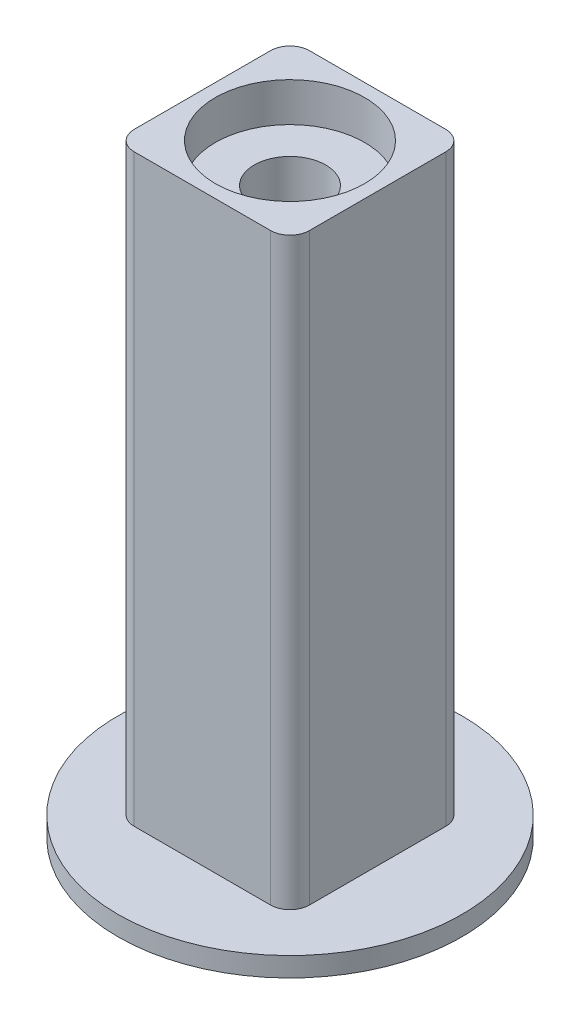
ISO-10303-21;
HEADER;
FILE_DESCRIPTION(('STEP AP214'),'2;1');
FILE_NAME('part.step','',(''),(''),'','','');
FILE_SCHEMA(('AUTOMOTIVE_DESIGN { 1 0 10303 214 1 1 1 1 }'));
ENDSEC;
DATA;
#1=APPLICATION_CONTEXT('core data for automotive mechanical design processes');
#2=APPLICATION_PROTOCOL_DEFINITION('international standard','automotive_design',2000,#1);
#3=PRODUCT_CONTEXT('',#1,'mechanical');
#4=PRODUCT('Part','Part','',(#3));
#5=PRODUCT_RELATED_PRODUCT_CATEGORY('part','',(#4));
#6=PRODUCT_DEFINITION_FORMATION('','',#4);
#7=PRODUCT_DEFINITION_CONTEXT('part definition',#1,'design');
#8=PRODUCT_DEFINITION('design','',#6,#7);
#9=PRODUCT_DEFINITION_SHAPE('','',#8);
#10=(LENGTH_UNIT() NAMED_UNIT(*) SI_UNIT(.MILLI.,.METRE.));
#11=(NAMED_UNIT(*) PLANE_ANGLE_UNIT() SI_UNIT($,.RADIAN.));
#12=(NAMED_UNIT(*) SI_UNIT($,.STERADIAN.) SOLID_ANGLE_UNIT());
#13=UNCERTAINTY_MEASURE_WITH_UNIT(LENGTH_MEASURE(1.E-05),#10,'distance_accuracy_value','');
#14=(GEOMETRIC_REPRESENTATION_CONTEXT(3) GLOBAL_UNCERTAINTY_ASSIGNED_CONTEXT((#13)) GLOBAL_UNIT_ASSIGNED_CONTEXT((#10,
#11,#12)) REPRESENTATION_CONTEXT('',''));
#15=CARTESIAN_POINT('',(0.,0.,0.));
#16=DIRECTION('',(0.,0.,1.));
#17=DIRECTION('',(1.,0.,0.));
#18=AXIS2_PLACEMENT_3D('',#15,#16,#17);
#19=CARTESIAN_POINT('',(0.,3.,0.));
#20=DIRECTION('',(0.,-1.,0.));
#21=DIRECTION('',(0.,0.,-1.));
#22=AXIS2_PLACEMENT_3D('',#19,#20,#21);
#23=CYLINDRICAL_SURFACE('',#22,26.5);
#24=CARTESIAN_POINT('',(0.,3.,0.));
#25=DIRECTION('',(0.,1.,0.));
#26=DIRECTION('',(0.,0.,1.));
#27=AXIS2_PLACEMENT_3D('',#24,#25,#26);
#28=CIRCLE('',#27,26.5);
#29=CARTESIAN_POINT('',(0.,3.,26.5));
#30=VERTEX_POINT('',#29);
#31=EDGE_CURVE('E147',#30,#30,#28,.T.);
#32=ORIENTED_EDGE('',*,*,#31,.F.);
#33=EDGE_LOOP('',(#32));
#34=FACE_BOUND('',#33,.T.);
#35=CARTESIAN_POINT('',(0.,0.,0.));
#36=DIRECTION('',(0.,1.,0.));
#37=DIRECTION('',(0.,0.,1.));
#38=AXIS2_PLACEMENT_3D('',#35,#36,#37);
#39=CIRCLE('',#38,26.5);
#40=CARTESIAN_POINT('',(0.,0.,26.5));
#41=VERTEX_POINT('',#40);
#42=EDGE_CURVE('E151',#41,#41,#39,.T.);
#43=ORIENTED_EDGE('',*,*,#42,.T.);
#44=EDGE_LOOP('',(#43));
#45=FACE_BOUND('',#44,.T.);
#46=ADVANCED_FACE('F39',(#34,#45),#23,.T.);
#47=CARTESIAN_POINT('',(0.,3.,0.));
#48=DIRECTION('',(0.,1.,0.));
#49=DIRECTION('',(0.,0.,1.));
#50=AXIS2_PLACEMENT_3D('',#47,#48,#49);
#51=PLANE('',#50);
#52=DIRECTION('',(0.,0.,-1.));
#53=VECTOR('',#52,1.);
#54=CARTESIAN_POINT('',(13.5,3.,-13.5));
#55=LINE('',#54,#53);
#56=CARTESIAN_POINT('',(13.5,3.,10.5));
#57=VERTEX_POINT('',#56);
#58=CARTESIAN_POINT('',(13.5,3.,-10.5));
#59=VERTEX_POINT('',#58);
#60=EDGE_CURVE('E133',#57,#59,#55,.T.);
#61=ORIENTED_EDGE('',*,*,#60,.F.);
#62=CARTESIAN_POINT('',(10.5,3.,10.5));
#63=DIRECTION('',(0.,1.,0.));
#64=DIRECTION('',(0.,0.,1.));
#65=AXIS2_PLACEMENT_3D('',#62,#63,#64);
#66=CIRCLE('',#65,3.);
#67=CARTESIAN_POINT('',(10.5,3.,13.5));
#68=VERTEX_POINT('',#67);
#69=EDGE_CURVE('E11',#57,#68,#66,.F.);
#70=ORIENTED_EDGE('',*,*,#69,.T.);
#71=DIRECTION('',(1.,0.,0.));
#72=VECTOR('',#71,1.);
#73=CARTESIAN_POINT('',(-13.5,3.,13.5));
#74=LINE('',#73,#72);
#75=CARTESIAN_POINT('',(-10.5,3.,13.5));
#76=VERTEX_POINT('',#75);
#77=EDGE_CURVE('E138',#76,#68,#74,.T.);
#78=ORIENTED_EDGE('',*,*,#77,.F.);
#79=CARTESIAN_POINT('',(-10.5,3.,10.5));
#80=DIRECTION('',(0.,1.,0.));
#81=DIRECTION('',(0.,0.,1.));
#82=AXIS2_PLACEMENT_3D('',#79,#80,#81);
#83=CIRCLE('',#82,3.);
#84=CARTESIAN_POINT('',(-13.5,3.,10.5));
#85=VERTEX_POINT('',#84);
#86=EDGE_CURVE('E48',#76,#85,#83,.F.);
#87=ORIENTED_EDGE('',*,*,#86,.T.);
#88=DIRECTION('',(0.,0.,1.));
#89=VECTOR('',#88,1.);
#90=CARTESIAN_POINT('',(-13.5,3.,-13.5));
#91=LINE('',#90,#89);
#92=CARTESIAN_POINT('',(-13.5,3.,-10.5));
#93=VERTEX_POINT('',#92);
#94=EDGE_CURVE('E132',#93,#85,#91,.T.);
#95=ORIENTED_EDGE('',*,*,#94,.F.);
#96=CARTESIAN_POINT('',(-10.5,3.,-10.5));
#97=DIRECTION('',(0.,1.,0.));
#98=DIRECTION('',(0.,0.,1.));
#99=AXIS2_PLACEMENT_3D('',#96,#97,#98);
#100=CIRCLE('',#99,3.);
#101=CARTESIAN_POINT('',(-10.5,3.,-13.5));
#102=VERTEX_POINT('',#101);
#103=EDGE_CURVE('E113',#93,#102,#100,.F.);
#104=ORIENTED_EDGE('',*,*,#103,.T.);
#105=DIRECTION('',(-1.,0.,0.));
#106=VECTOR('',#105,1.);
#107=CARTESIAN_POINT('',(-13.5,3.,-13.5));
#108=LINE('',#107,#106);
#109=CARTESIAN_POINT('',(10.5,3.,-13.5));
#110=VERTEX_POINT('',#109);
#111=EDGE_CURVE('E120',#110,#102,#108,.T.);
#112=ORIENTED_EDGE('',*,*,#111,.F.);
#113=CARTESIAN_POINT('',(10.5,3.,-10.5));
#114=DIRECTION('',(0.,1.,0.));
#115=DIRECTION('',(0.,0.,1.));
#116=AXIS2_PLACEMENT_3D('',#113,#114,#115);
#117=CIRCLE('',#116,3.);
#118=EDGE_CURVE('E104',#110,#59,#117,.F.);
#119=ORIENTED_EDGE('',*,*,#118,.T.);
#120=EDGE_LOOP('',(#61,#70,#78,#87,#95,#104,#112,#119));
#121=FACE_BOUND('',#120,.T.);
#122=ORIENTED_EDGE('',*,*,#31,.T.);
#123=EDGE_LOOP('',(#122));
#124=FACE_BOUND('',#123,.T.);
#125=ADVANCED_FACE('F128',(#121,#124),#51,.T.);
#126=CARTESIAN_POINT('',(0.,0.,0.));
#127=DIRECTION('',(0.,1.,0.));
#128=DIRECTION('',(0.,0.,1.));
#129=AXIS2_PLACEMENT_3D('',#126,#127,#128);
#130=PLANE('',#129);
#131=ORIENTED_EDGE('',*,*,#42,.F.);
#132=EDGE_LOOP('',(#131));
#133=FACE_BOUND('',#132,.T.);
#134=ADVANCED_FACE('F255',(#133),#130,.F.);
#135=CARTESIAN_POINT('',(13.5,93.,-13.5));
#136=DIRECTION('',(-1.,0.,0.));
#137=DIRECTION('',(0.,0.,1.));
#138=AXIS2_PLACEMENT_3D('',#135,#136,#137);
#139=PLANE('',#138);
#140=ORIENTED_EDGE('',*,*,#60,.T.);
#141=DIRECTION('',(0.,-1.,0.));
#142=VECTOR('',#141,1.);
#143=CARTESIAN_POINT('',(13.5,93.,-10.5));
#144=LINE('',#143,#142);
#145=CARTESIAN_POINT('',(13.5,93.,-10.5));
#146=VERTEX_POINT('',#145);
#147=EDGE_CURVE('E109',#59,#146,#144,.F.);
#148=ORIENTED_EDGE('',*,*,#147,.T.);
#149=DIRECTION('',(0.,0.,-1.));
#150=VECTOR('',#149,1.);
#151=CARTESIAN_POINT('',(13.5,93.,-13.5));
#152=LINE('',#151,#150);
#153=CARTESIAN_POINT('',(13.5,93.,10.5));
#154=VERTEX_POINT('',#153);
#155=EDGE_CURVE('E146',#154,#146,#152,.T.);
#156=ORIENTED_EDGE('',*,*,#155,.F.);
#157=DIRECTION('',(0.,-1.,0.));
#158=VECTOR('',#157,1.);
#159=CARTESIAN_POINT('',(13.5,93.,10.5));
#160=LINE('',#159,#158);
#161=EDGE_CURVE('E125',#154,#57,#160,.T.);
#162=ORIENTED_EDGE('',*,*,#161,.T.);
#163=EDGE_LOOP('',(#140,#148,#156,#162));
#164=FACE_BOUND('',#163,.T.);
#165=ADVANCED_FACE('F277',(#164),#139,.F.);
#166=CARTESIAN_POINT('',(-13.5,93.,-13.5));
#167=DIRECTION('',(0.,0.,1.));
#168=DIRECTION('',(1.,0.,0.));
#169=AXIS2_PLACEMENT_3D('',#166,#167,#168);
#170=PLANE('',#169);
#171=DIRECTION('',(-1.,0.,0.));
#172=VECTOR('',#171,1.);
#173=CARTESIAN_POINT('',(-13.5,93.,-13.5));
#174=LINE('',#173,#172);
#175=CARTESIAN_POINT('',(10.5,93.,-13.5));
#176=VERTEX_POINT('',#175);
#177=CARTESIAN_POINT('',(-10.5,93.,-13.5));
#178=VERTEX_POINT('',#177);
#179=EDGE_CURVE('E123',#176,#178,#174,.T.);
#180=ORIENTED_EDGE('',*,*,#179,.F.);
#181=DIRECTION('',(0.,-1.,0.));
#182=VECTOR('',#181,1.);
#183=CARTESIAN_POINT('',(10.5,93.,-13.5));
#184=LINE('',#183,#182);
#185=EDGE_CURVE('E108',#176,#110,#184,.T.);
#186=ORIENTED_EDGE('',*,*,#185,.T.);
#187=ORIENTED_EDGE('',*,*,#111,.T.);
#188=DIRECTION('',(0.,-1.,0.));
#189=VECTOR('',#188,1.);
#190=CARTESIAN_POINT('',(-10.5,93.,-13.5));
#191=LINE('',#190,#189);
#192=EDGE_CURVE('E126',#102,#178,#191,.F.);
#193=ORIENTED_EDGE('',*,*,#192,.T.);
#194=EDGE_LOOP('',(#180,#186,#187,#193));
#195=FACE_BOUND('',#194,.T.);
#196=ADVANCED_FACE('F119',(#195),#170,.F.);
#197=CARTESIAN_POINT('',(-13.5,93.,-13.5));
#198=DIRECTION('',(1.,0.,0.));
#199=DIRECTION('',(0.,0.,-1.));
#200=AXIS2_PLACEMENT_3D('',#197,#198,#199);
#201=PLANE('',#200);
#202=DIRECTION('',(0.,0.,1.));
#203=VECTOR('',#202,1.);
#204=CARTESIAN_POINT('',(-13.5,93.,-13.5));
#205=LINE('',#204,#203);
#206=CARTESIAN_POINT('',(-13.5,93.,-10.5));
#207=VERTEX_POINT('',#206);
#208=CARTESIAN_POINT('',(-13.5,93.,10.5));
#209=VERTEX_POINT('',#208);
#210=EDGE_CURVE('E207',#207,#209,#205,.T.);
#211=ORIENTED_EDGE('',*,*,#210,.F.);
#212=DIRECTION('',(0.,-1.,0.));
#213=VECTOR('',#212,1.);
#214=CARTESIAN_POINT('',(-13.5,93.,-10.5));
#215=LINE('',#214,#213);
#216=EDGE_CURVE('E183',#207,#93,#215,.T.);
#217=ORIENTED_EDGE('',*,*,#216,.T.);
#218=ORIENTED_EDGE('',*,*,#94,.T.);
#219=DIRECTION('',(0.,-1.,0.));
#220=VECTOR('',#219,1.);
#221=CARTESIAN_POINT('',(-13.5,93.,10.5));
#222=LINE('',#221,#220);
#223=EDGE_CURVE('E180',#85,#209,#222,.F.);
#224=ORIENTED_EDGE('',*,*,#223,.T.);
#225=EDGE_LOOP('',(#211,#217,#218,#224));
#226=FACE_BOUND('',#225,.T.);
#227=ADVANCED_FACE('F196',(#226),#201,.F.);
#228=CARTESIAN_POINT('',(-13.5,93.,13.5));
#229=DIRECTION('',(0.,0.,-1.));
#230=DIRECTION('',(-1.,0.,0.));
#231=AXIS2_PLACEMENT_3D('',#228,#229,#230);
#232=PLANE('',#231);
#233=DIRECTION('',(1.,0.,0.));
#234=VECTOR('',#233,1.);
#235=CARTESIAN_POINT('',(-13.5,93.,13.5));
#236=LINE('',#235,#234);
#237=CARTESIAN_POINT('',(-10.5,93.,13.5));
#238=VERTEX_POINT('',#237);
#239=CARTESIAN_POINT('',(10.5,93.,13.5));
#240=VERTEX_POINT('',#239);
#241=EDGE_CURVE('E155',#238,#240,#236,.T.);
#242=ORIENTED_EDGE('',*,*,#241,.F.);
#243=DIRECTION('',(0.,-1.,0.));
#244=VECTOR('',#243,1.);
#245=CARTESIAN_POINT('',(-10.5,93.,13.5));
#246=LINE('',#245,#244);
#247=EDGE_CURVE('E114',#238,#76,#246,.T.);
#248=ORIENTED_EDGE('',*,*,#247,.T.);
#249=ORIENTED_EDGE('',*,*,#77,.T.);
#250=DIRECTION('',(0.,-1.,0.));
#251=VECTOR('',#250,1.);
#252=CARTESIAN_POINT('',(10.5,93.,13.5));
#253=LINE('',#252,#251);
#254=EDGE_CURVE('E187',#68,#240,#253,.F.);
#255=ORIENTED_EDGE('',*,*,#254,.T.);
#256=EDGE_LOOP('',(#242,#248,#249,#255));
#257=FACE_BOUND('',#256,.T.);
#258=ADVANCED_FACE('F209',(#257),#232,.F.);
#259=CARTESIAN_POINT('',(0.,93.,0.));
#260=DIRECTION('',(0.,1.,0.));
#261=DIRECTION('',(0.,0.,1.));
#262=AXIS2_PLACEMENT_3D('',#259,#260,#261);
#263=PLANE('',#262);
#264=CARTESIAN_POINT('',(0.,93.,0.));
#265=DIRECTION('',(0.,1.,0.));
#266=DIRECTION('',(0.,0.,1.));
#267=AXIS2_PLACEMENT_3D('',#264,#265,#266);
#268=CIRCLE('',#267,11.5);
#269=CARTESIAN_POINT('',(0.,93.,11.5));
#270=VERTEX_POINT('',#269);
#271=EDGE_CURVE('E222',#270,#270,#268,.T.);
#272=ORIENTED_EDGE('',*,*,#271,.F.);
#273=EDGE_LOOP('',(#272));
#274=FACE_BOUND('',#273,.T.);
#275=ORIENTED_EDGE('',*,*,#155,.T.);
#276=CARTESIAN_POINT('',(10.5,93.,-10.5));
#277=DIRECTION('',(0.,1.,0.));
#278=DIRECTION('',(0.,0.,1.));
#279=AXIS2_PLACEMENT_3D('',#276,#277,#278);
#280=CIRCLE('',#279,3.);
#281=EDGE_CURVE('E177',#146,#176,#280,.T.);
#282=ORIENTED_EDGE('',*,*,#281,.T.);
#283=ORIENTED_EDGE('',*,*,#179,.T.);
#284=CARTESIAN_POINT('',(-10.5,93.,-10.5));
#285=DIRECTION('',(0.,1.,0.));
#286=DIRECTION('',(0.,0.,1.));
#287=AXIS2_PLACEMENT_3D('',#284,#285,#286);
#288=CIRCLE('',#287,3.);
#289=EDGE_CURVE('E174',#178,#207,#288,.T.);
#290=ORIENTED_EDGE('',*,*,#289,.T.);
#291=ORIENTED_EDGE('',*,*,#210,.T.);
#292=CARTESIAN_POINT('',(-10.5,93.,10.5));
#293=DIRECTION('',(0.,1.,0.));
#294=DIRECTION('',(0.,0.,1.));
#295=AXIS2_PLACEMENT_3D('',#292,#293,#294);
#296=CIRCLE('',#295,3.);
#297=EDGE_CURVE('E171',#209,#238,#296,.T.);
#298=ORIENTED_EDGE('',*,*,#297,.T.);
#299=ORIENTED_EDGE('',*,*,#241,.T.);
#300=CARTESIAN_POINT('',(10.5,93.,10.5));
#301=DIRECTION('',(0.,1.,0.));
#302=DIRECTION('',(0.,0.,1.));
#303=AXIS2_PLACEMENT_3D('',#300,#301,#302);
#304=CIRCLE('',#303,3.);
#305=EDGE_CURVE('E168',#240,#154,#304,.T.);
#306=ORIENTED_EDGE('',*,*,#305,.T.);
#307=EDGE_LOOP('',(#275,#282,#283,#290,#291,#298,#299,#306));
#308=FACE_BOUND('',#307,.T.);
#309=ADVANCED_FACE('F205',(#274,#308),#263,.T.);
#310=CARTESIAN_POINT('',(0.,87.,0.));
#311=DIRECTION('',(0.,1.,0.));
#312=DIRECTION('',(0.,0.,1.));
#313=AXIS2_PLACEMENT_3D('',#310,#311,#312);
#314=PLANE('',#313);
#315=CARTESIAN_POINT('',(0.,87.,0.));
#316=DIRECTION('',(0.,1.,0.));
#317=DIRECTION('',(0.,0.,1.));
#318=AXIS2_PLACEMENT_3D('',#315,#316,#317);
#319=CIRCLE('',#318,11.5);
#320=CARTESIAN_POINT('',(0.,87.,11.5));
#321=VERTEX_POINT('',#320);
#322=EDGE_CURVE('E160',#321,#321,#319,.T.);
#323=ORIENTED_EDGE('',*,*,#322,.T.);
#324=EDGE_LOOP('',(#323));
#325=FACE_BOUND('',#324,.T.);
#326=CARTESIAN_POINT('',(0.,87.,0.));
#327=DIRECTION('',(0.,1.,0.));
#328=DIRECTION('',(0.,0.,1.));
#329=AXIS2_PLACEMENT_3D('',#326,#327,#328);
#330=CIRCLE('',#329,5.5);
#331=CARTESIAN_POINT('',(0.,87.,5.5));
#332=VERTEX_POINT('',#331);
#333=EDGE_CURVE('E156',#332,#332,#330,.F.);
#334=ORIENTED_EDGE('',*,*,#333,.T.);
#335=EDGE_LOOP('',(#334));
#336=FACE_BOUND('',#335,.T.);
#337=ADVANCED_FACE('F230',(#325,#336),#314,.T.);
#338=CARTESIAN_POINT('',(0.,87.,0.));
#339=DIRECTION('',(0.,1.,0.));
#340=DIRECTION('',(0.,0.,1.));
#341=AXIS2_PLACEMENT_3D('',#338,#339,#340);
#342=CYLINDRICAL_SURFACE('',#341,11.5);
#343=ORIENTED_EDGE('',*,*,#322,.F.);
#344=EDGE_LOOP('',(#343));
#345=FACE_BOUND('',#344,.T.);
#346=ORIENTED_EDGE('',*,*,#271,.T.);
#347=EDGE_LOOP('',(#346));
#348=FACE_BOUND('',#347,.T.);
#349=ADVANCED_FACE('F233',(#345,#348),#342,.F.);
#350=CARTESIAN_POINT('',(0.,3.,0.));
#351=DIRECTION('',(0.,1.,0.));
#352=DIRECTION('',(0.,0.,1.));
#353=AXIS2_PLACEMENT_3D('',#350,#351,#352);
#354=PLANE('',#353);
#355=CARTESIAN_POINT('',(0.,3.,0.));
#356=DIRECTION('',(0.,1.,0.));
#357=DIRECTION('',(0.,0.,1.));
#358=AXIS2_PLACEMENT_3D('',#355,#356,#357);
#359=CIRCLE('',#358,5.5);
#360=CARTESIAN_POINT('',(0.,3.,5.5));
#361=VERTEX_POINT('',#360);
#362=EDGE_CURVE('E140',#361,#361,#359,.T.);
#363=ORIENTED_EDGE('',*,*,#362,.T.);
#364=EDGE_LOOP('',(#363));
#365=FACE_BOUND('',#364,.T.);
#366=ADVANCED_FACE('F236',(#365),#354,.T.);
#367=CARTESIAN_POINT('',(0.,3.,0.));
#368=DIRECTION('',(0.,1.,0.));
#369=DIRECTION('',(0.,0.,1.));
#370=AXIS2_PLACEMENT_3D('',#367,#368,#369);
#371=CYLINDRICAL_SURFACE('',#370,5.5);
#372=CARTESIAN_POINT('',(0.,3.,5.5));
#373=CARTESIAN_POINT('',(0.,3.875,5.5));
#374=CARTESIAN_POINT('',(0.,4.75,5.5));
#375=CARTESIAN_POINT('',(0.,6.5,5.5));
#376=CARTESIAN_POINT('',(0.,7.375,5.5));
#377=CARTESIAN_POINT('',(0.,9.125,5.5));
#378=CARTESIAN_POINT('',(0.,10.,5.5));
#379=CARTESIAN_POINT('',(0.,11.75,5.5));
#380=CARTESIAN_POINT('',(0.,12.625,5.5));
#381=CARTESIAN_POINT('',(0.,14.375,5.5));
#382=CARTESIAN_POINT('',(0.,15.25,5.5));
#383=CARTESIAN_POINT('',(0.,17.,5.5));
#384=CARTESIAN_POINT('',(0.,17.875,5.5));
#385=CARTESIAN_POINT('',(0.,19.625,5.5));
#386=CARTESIAN_POINT('',(0.,20.5,5.5));
#387=CARTESIAN_POINT('',(0.,22.25,5.5));
#388=CARTESIAN_POINT('',(0.,23.125,5.5));
#389=CARTESIAN_POINT('',(0.,24.875,5.5));
#390=CARTESIAN_POINT('',(0.,25.75,5.5));
#391=CARTESIAN_POINT('',(0.,27.5,5.5));
#392=CARTESIAN_POINT('',(0.,28.375,5.5));
#393=CARTESIAN_POINT('',(0.,30.125,5.5));
#394=CARTESIAN_POINT('',(0.,31.,5.5));
#395=CARTESIAN_POINT('',(0.,32.75,5.5));
#396=CARTESIAN_POINT('',(0.,33.625,5.5));
#397=CARTESIAN_POINT('',(0.,35.375,5.5));
#398=CARTESIAN_POINT('',(0.,36.25,5.5));
#399=CARTESIAN_POINT('',(0.,38.,5.5));
#400=CARTESIAN_POINT('',(0.,38.875,5.5));
#401=CARTESIAN_POINT('',(0.,40.625,5.5));
#402=CARTESIAN_POINT('',(0.,41.5,5.5));
#403=CARTESIAN_POINT('',(0.,43.25,5.5));
#404=CARTESIAN_POINT('',(0.,44.125,5.5));
#405=CARTESIAN_POINT('',(0.,45.875,5.5));
#406=CARTESIAN_POINT('',(0.,46.75,5.5));
#407=CARTESIAN_POINT('',(0.,48.5,5.5));
#408=CARTESIAN_POINT('',(0.,49.375,5.5));
#409=CARTESIAN_POINT('',(0.,51.125,5.5));
#410=CARTESIAN_POINT('',(0.,52.,5.5));
#411=CARTESIAN_POINT('',(0.,53.75,5.5));
#412=CARTESIAN_POINT('',(0.,54.625,5.5));
#413=CARTESIAN_POINT('',(0.,56.375,5.5));
#414=CARTESIAN_POINT('',(0.,57.25,5.5));
#415=CARTESIAN_POINT('',(0.,59.,5.5));
#416=CARTESIAN_POINT('',(0.,59.875,5.5));
#417=CARTESIAN_POINT('',(0.,61.625,5.5));
#418=CARTESIAN_POINT('',(0.,62.5,5.5));
#419=CARTESIAN_POINT('',(0.,64.25,5.5));
#420=CARTESIAN_POINT('',(0.,65.125,5.5));
#421=CARTESIAN_POINT('',(0.,66.875,5.5));
#422=CARTESIAN_POINT('',(0.,67.75,5.5));
#423=CARTESIAN_POINT('',(0.,69.5,5.5));
#424=CARTESIAN_POINT('',(0.,70.375,5.5));
#425=CARTESIAN_POINT('',(0.,72.125,5.5));
#426=CARTESIAN_POINT('',(0.,73.,5.5));
#427=CARTESIAN_POINT('',(0.,74.75,5.5));
#428=CARTESIAN_POINT('',(0.,75.625,5.5));
#429=CARTESIAN_POINT('',(0.,77.375,5.5));
#430=CARTESIAN_POINT('',(0.,78.25,5.5));
#431=CARTESIAN_POINT('',(0.,80.,5.5));
#432=CARTESIAN_POINT('',(0.,80.875,5.5));
#433=CARTESIAN_POINT('',(0.,82.625,5.5));
#434=CARTESIAN_POINT('',(0.,83.5,5.5));
#435=CARTESIAN_POINT('',(0.,85.25,5.5));
#436=CARTESIAN_POINT('',(0.,86.125,5.5));
#437=CARTESIAN_POINT('',(0.,87.,5.5));
#438=B_SPLINE_CURVE_WITH_KNOTS('',3,(#372,#373,#374,#375,#376,#377,#378,#379,#380,#381,#382,
#383,#384,#385,#386,#387,#388,#389,#390,#391,#392,#393,#394,#395,#396,#397,#398,#399,#400,#401,
#402,#403,#404,#405,#406,#407,#408,#409,#410,#411,#412,#413,#414,#415,#416,#417,#418,#419,#420,
#421,#422,#423,#424,#425,#426,#427,#428,#429,#430,#431,#432,#433,#434,#435,#436,#437),
.UNSPECIFIED.,.F.,.F.,(4,2,2,2,2,2,2,2,2,2,2,2,2,2,2,2,2,2,2,2,2,2,2,2,2,2,2,2,2,2,2,2,4),(0.,
2.625,5.25,7.875,10.5,13.125,15.75,18.375,21.,23.625,26.25,28.875,31.5,34.125,36.75,39.375,42.,
44.625,47.25,49.875,52.5,55.125,57.75,60.375,63.,65.625,68.25,70.875,73.5,76.125,78.75,81.375,
84.),.UNSPECIFIED.);
#439=EDGE_CURVE('BSEAM264',#361,#332,#438,.T.);
#440=ORIENTED_EDGE('',*,*,#362,.F.);
#441=ORIENTED_EDGE('',*,*,#333,.F.);
#442=ORIENTED_EDGE('',*,*,#439,.T.);
#443=ORIENTED_EDGE('',*,*,#439,.F.);
#444=EDGE_LOOP('',(#440,#442,#441,#443));
#445=FACE_BOUND('',#444,.T.);
#446=ADVANCED_FACE('F264',(#445),#371,.F.);
#447=CARTESIAN_POINT('',(10.5,93.,-10.5));
#448=DIRECTION('',(0.,-1.,0.));
#449=DIRECTION('',(0.,0.,-1.));
#450=AXIS2_PLACEMENT_3D('',#447,#448,#449);
#451=CYLINDRICAL_SURFACE('',#450,3.);
#452=ORIENTED_EDGE('',*,*,#281,.F.);
#453=ORIENTED_EDGE('',*,*,#147,.F.);
#454=ORIENTED_EDGE('',*,*,#118,.F.);
#455=ORIENTED_EDGE('',*,*,#185,.F.);
#456=EDGE_LOOP('',(#452,#453,#454,#455));
#457=FACE_BOUND('',#456,.T.);
#458=ADVANCED_FACE('F107',(#457),#451,.T.);
#459=CARTESIAN_POINT('',(-10.5,93.,-10.5));
#460=DIRECTION('',(0.,-1.,0.));
#461=DIRECTION('',(0.,0.,-1.));
#462=AXIS2_PLACEMENT_3D('',#459,#460,#461);
#463=CYLINDRICAL_SURFACE('',#462,3.);
#464=ORIENTED_EDGE('',*,*,#289,.F.);
#465=ORIENTED_EDGE('',*,*,#192,.F.);
#466=ORIENTED_EDGE('',*,*,#103,.F.);
#467=ORIENTED_EDGE('',*,*,#216,.F.);
#468=EDGE_LOOP('',(#464,#465,#466,#467));
#469=FACE_BOUND('',#468,.T.);
#470=ADVANCED_FACE('F263',(#469),#463,.T.);
#471=CARTESIAN_POINT('',(-10.5,93.,10.5));
#472=DIRECTION('',(0.,-1.,0.));
#473=DIRECTION('',(0.,0.,-1.));
#474=AXIS2_PLACEMENT_3D('',#471,#472,#473);
#475=CYLINDRICAL_SURFACE('',#474,3.);
#476=ORIENTED_EDGE('',*,*,#297,.F.);
#477=ORIENTED_EDGE('',*,*,#223,.F.);
#478=ORIENTED_EDGE('',*,*,#86,.F.);
#479=ORIENTED_EDGE('',*,*,#247,.F.);
#480=EDGE_LOOP('',(#476,#477,#478,#479));
#481=FACE_BOUND('',#480,.T.);
#482=ADVANCED_FACE('F200',(#481),#475,.T.);
#483=CARTESIAN_POINT('',(10.5,93.,10.5));
#484=DIRECTION('',(0.,-1.,0.));
#485=DIRECTION('',(0.,0.,-1.));
#486=AXIS2_PLACEMENT_3D('',#483,#484,#485);
#487=CYLINDRICAL_SURFACE('',#486,3.);
#488=ORIENTED_EDGE('',*,*,#305,.F.);
#489=ORIENTED_EDGE('',*,*,#254,.F.);
#490=ORIENTED_EDGE('',*,*,#69,.F.);
#491=ORIENTED_EDGE('',*,*,#161,.F.);
#492=EDGE_LOOP('',(#488,#489,#490,#491));
#493=FACE_BOUND('',#492,.T.);
#494=ADVANCED_FACE('F41',(#493),#487,.T.);
#495=CLOSED_SHELL('',(#46,#125,#134,#165,#196,#227,#258,#309,#337,#349,#366,#446,#458,#470,#482,#494));
#496=MANIFOLD_SOLID_BREP('B2',#495);
#497=ADVANCED_BREP_SHAPE_REPRESENTATION('',(#18,#496),#14);
#498=SHAPE_DEFINITION_REPRESENTATION(#9,#497);
ENDSEC;
END-ISO-10303-21;
